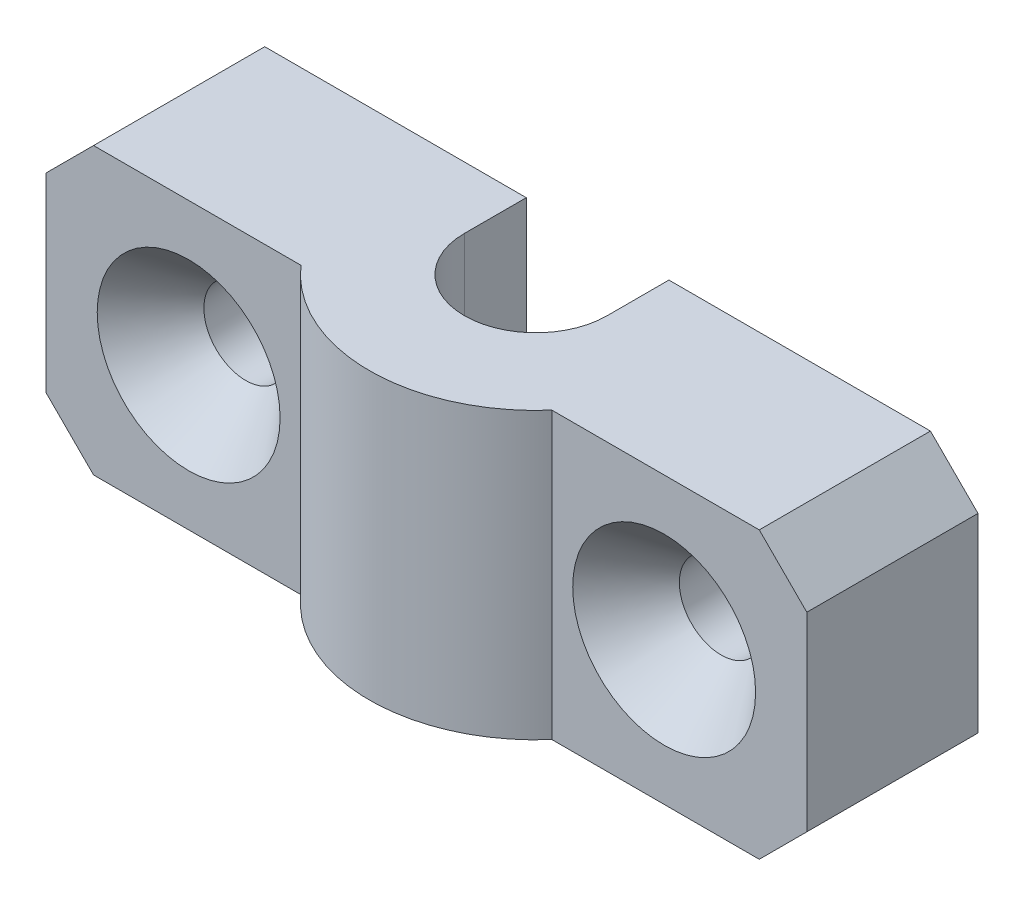
ISO-10303-21;
HEADER;
FILE_DESCRIPTION(('STEP AP214'),'2;1');
FILE_NAME('part.step','',(''),(''),'','','');
FILE_SCHEMA(('AUTOMOTIVE_DESIGN { 1 0 10303 214 1 1 1 1 }'));
ENDSEC;
DATA;
#1=APPLICATION_CONTEXT('core data for automotive mechanical design processes');
#2=APPLICATION_PROTOCOL_DEFINITION('international standard','automotive_design',2000,#1);
#3=PRODUCT_CONTEXT('',#1,'mechanical');
#4=PRODUCT('Part','Part','',(#3));
#5=PRODUCT_RELATED_PRODUCT_CATEGORY('part','',(#4));
#6=PRODUCT_DEFINITION_FORMATION('','',#4);
#7=PRODUCT_DEFINITION_CONTEXT('part definition',#1,'design');
#8=PRODUCT_DEFINITION('design','',#6,#7);
#9=PRODUCT_DEFINITION_SHAPE('','',#8);
#10=(LENGTH_UNIT() NAMED_UNIT(*) SI_UNIT(.MILLI.,.METRE.));
#11=(NAMED_UNIT(*) PLANE_ANGLE_UNIT() SI_UNIT($,.RADIAN.));
#12=(NAMED_UNIT(*) SI_UNIT($,.STERADIAN.) SOLID_ANGLE_UNIT());
#13=UNCERTAINTY_MEASURE_WITH_UNIT(LENGTH_MEASURE(1.E-05),#10,'distance_accuracy_value','');
#14=(GEOMETRIC_REPRESENTATION_CONTEXT(3) GLOBAL_UNCERTAINTY_ASSIGNED_CONTEXT((#13)) GLOBAL_UNIT_ASSIGNED_CONTEXT((#10,
#11,#12)) REPRESENTATION_CONTEXT('',''));
#15=CARTESIAN_POINT('',(0.,0.,0.));
#16=DIRECTION('',(0.,0.,1.));
#17=DIRECTION('',(1.,0.,0.));
#18=AXIS2_PLACEMENT_3D('',#15,#16,#17);
#19=CARTESIAN_POINT('',(0.,0.,9.));
#20=DIRECTION('',(0.,0.,1.));
#21=DIRECTION('',(1.,0.,0.));
#22=AXIS2_PLACEMENT_3D('',#19,#20,#21);
#23=PLANE('',#22);
#24=CARTESIAN_POINT('',(7.5,-7.5,9.));
#25=DIRECTION('',(0.,0.,1.));
#26=DIRECTION('',(1.,0.,0.));
#27=AXIS2_PLACEMENT_3D('',#24,#25,#26);
#28=CIRCLE('',#27,4.80786021344867);
#29=CARTESIAN_POINT('',(12.3078602134487,-7.5,9.));
#30=VERTEX_POINT('',#29);
#31=EDGE_CURVE('E340',#30,#30,#28,.T.);
#32=ORIENTED_EDGE('',*,*,#31,.F.);
#33=EDGE_LOOP('',(#32));
#34=FACE_BOUND('',#33,.T.);
#35=DIRECTION('',(-1.,0.,0.));
#36=VECTOR('',#35,1.);
#37=CARTESIAN_POINT('',(0.,0.,9.));
#38=LINE('',#37,#36);
#39=CARTESIAN_POINT('',(13.4045470208635,0.,9.));
#40=VERTEX_POINT('',#39);
#41=CARTESIAN_POINT('',(2.50000000000002,0.,9.));
#42=VERTEX_POINT('',#41);
#43=EDGE_CURVE('E211',#40,#42,#38,.T.);
#44=ORIENTED_EDGE('',*,*,#43,.T.);
#45=DIRECTION('',(0.707106781186549,0.707106781186546,0.));
#46=VECTOR('',#45,1.);
#47=CARTESIAN_POINT('',(1.25,-1.25000000000001,9.));
#48=LINE('',#47,#46);
#49=CARTESIAN_POINT('',(0.,-2.5,9.));
#50=VERTEX_POINT('',#49);
#51=EDGE_CURVE('E11',#42,#50,#48,.F.);
#52=ORIENTED_EDGE('',*,*,#51,.T.);
#53=DIRECTION('',(0.,-1.,0.));
#54=VECTOR('',#53,1.);
#55=CARTESIAN_POINT('',(0.,0.,9.));
#56=LINE('',#55,#54);
#57=CARTESIAN_POINT('',(0.,-12.5,9.));
#58=VERTEX_POINT('',#57);
#59=EDGE_CURVE('E155',#50,#58,#56,.T.);
#60=ORIENTED_EDGE('',*,*,#59,.T.);
#61=DIRECTION('',(-0.707106781186546,0.707106781186549,0.));
#62=VECTOR('',#61,1.);
#63=CARTESIAN_POINT('',(-6.24999999999999,-6.24999999999996,9.));
#64=LINE('',#63,#62);
#65=CARTESIAN_POINT('',(2.5,-15.,9.));
#66=VERTEX_POINT('',#65);
#67=EDGE_CURVE('E50',#58,#66,#64,.F.);
#68=ORIENTED_EDGE('',*,*,#67,.T.);
#69=DIRECTION('',(1.,0.,0.));
#70=VECTOR('',#69,1.);
#71=CARTESIAN_POINT('',(0.,-15.,9.));
#72=LINE('',#71,#70);
#73=CARTESIAN_POINT('',(13.4045470208635,-15.,9.));
#74=VERTEX_POINT('',#73);
#75=EDGE_CURVE('E154',#66,#74,#72,.T.);
#76=ORIENTED_EDGE('',*,*,#75,.T.);
#77=DIRECTION('',(0.,-1.,0.));
#78=VECTOR('',#77,1.);
#79=CARTESIAN_POINT('',(13.4045470208635,0.,9.));
#80=LINE('',#79,#78);
#81=EDGE_CURVE('E166',#40,#74,#80,.T.);
#82=ORIENTED_EDGE('',*,*,#81,.F.);
#83=EDGE_LOOP('',(#44,#52,#60,#68,#76,#82));
#84=FACE_BOUND('',#83,.T.);
#85=ADVANCED_FACE('F41',(#34,#84),#23,.T.);
#86=CARTESIAN_POINT('',(0.,0.,0.));
#87=DIRECTION('',(0.,0.,1.));
#88=DIRECTION('',(1.,0.,0.));
#89=AXIS2_PLACEMENT_3D('',#86,#87,#88);
#90=PLANE('',#89);
#91=CARTESIAN_POINT('',(32.5,-7.5,0.));
#92=DIRECTION('',(0.,0.,-1.));
#93=DIRECTION('',(-1.,0.,0.));
#94=AXIS2_PLACEMENT_3D('',#91,#92,#93);
#95=CIRCLE('',#94,2.2);
#96=CARTESIAN_POINT('',(30.3,-7.5,0.));
#97=VERTEX_POINT('',#96);
#98=EDGE_CURVE('E335',#97,#97,#95,.T.);
#99=ORIENTED_EDGE('',*,*,#98,.F.);
#100=EDGE_LOOP('',(#99));
#101=FACE_BOUND('',#100,.T.);
#102=DIRECTION('',(-1.,0.,0.));
#103=VECTOR('',#102,1.);
#104=CARTESIAN_POINT('',(0.,0.,0.));
#105=LINE('',#104,#103);
#106=CARTESIAN_POINT('',(37.5,0.,0.));
#107=VERTEX_POINT('',#106);
#108=CARTESIAN_POINT('',(23.75,0.,0.));
#109=VERTEX_POINT('',#108);
#110=EDGE_CURVE('E207',#107,#109,#105,.T.);
#111=ORIENTED_EDGE('',*,*,#110,.F.);
#112=DIRECTION('',(-0.707106781186547,0.707106781186549,0.));
#113=VECTOR('',#112,1.);
#114=CARTESIAN_POINT('',(37.5,0.,0.));
#115=LINE('',#114,#113);
#116=CARTESIAN_POINT('',(40.,-2.50000000000001,0.));
#117=VERTEX_POINT('',#116);
#118=EDGE_CURVE('E229',#107,#117,#115,.F.);
#119=ORIENTED_EDGE('',*,*,#118,.T.);
#120=DIRECTION('',(0.,1.,0.));
#121=VECTOR('',#120,1.);
#122=CARTESIAN_POINT('',(40.,0.,0.));
#123=LINE('',#122,#121);
#124=CARTESIAN_POINT('',(40.,-12.5,0.));
#125=VERTEX_POINT('',#124);
#126=EDGE_CURVE('E218',#125,#117,#123,.T.);
#127=ORIENTED_EDGE('',*,*,#126,.F.);
#128=DIRECTION('',(0.707106781186549,0.707106781186546,0.));
#129=VECTOR('',#128,1.);
#130=CARTESIAN_POINT('',(40.,-12.5,0.));
#131=LINE('',#130,#129);
#132=CARTESIAN_POINT('',(37.5,-15.,0.));
#133=VERTEX_POINT('',#132);
#134=EDGE_CURVE('E227',#125,#133,#131,.F.);
#135=ORIENTED_EDGE('',*,*,#134,.T.);
#136=DIRECTION('',(1.,0.,0.));
#137=VECTOR('',#136,1.);
#138=CARTESIAN_POINT('',(0.,-15.,0.));
#139=LINE('',#138,#137);
#140=CARTESIAN_POINT('',(23.75,-15.,0.));
#141=VERTEX_POINT('',#140);
#142=EDGE_CURVE('E215',#141,#133,#139,.T.);
#143=ORIENTED_EDGE('',*,*,#142,.F.);
#144=DIRECTION('',(0.,-1.,0.));
#145=VECTOR('',#144,1.);
#146=CARTESIAN_POINT('',(23.75,0.,0.));
#147=LINE('',#146,#145);
#148=EDGE_CURVE('E190',#109,#141,#147,.T.);
#149=ORIENTED_EDGE('',*,*,#148,.F.);
#150=EDGE_LOOP('',(#111,#119,#127,#135,#143,#149));
#151=FACE_BOUND('',#150,.T.);
#152=ADVANCED_FACE('F284',(#101,#151),#90,.F.);
#153=CARTESIAN_POINT('',(0.,0.,9.));
#154=DIRECTION('',(1.,0.,0.));
#155=DIRECTION('',(0.,0.,-1.));
#156=AXIS2_PLACEMENT_3D('',#153,#154,#155);
#157=PLANE('',#156);
#158=ORIENTED_EDGE('',*,*,#59,.F.);
#159=DIRECTION('',(0.,0.,-1.));
#160=VECTOR('',#159,1.);
#161=CARTESIAN_POINT('',(0.,-2.5,9.));
#162=LINE('',#161,#160);
#163=CARTESIAN_POINT('',(0.,-2.5,0.));
#164=VERTEX_POINT('',#163);
#165=EDGE_CURVE('E245',#50,#164,#162,.T.);
#166=ORIENTED_EDGE('',*,*,#165,.T.);
#167=DIRECTION('',(0.,-1.,0.));
#168=VECTOR('',#167,1.);
#169=CARTESIAN_POINT('',(0.,0.,0.));
#170=LINE('',#169,#168);
#171=CARTESIAN_POINT('',(0.,-12.5,0.));
#172=VERTEX_POINT('',#171);
#173=EDGE_CURVE('E201',#164,#172,#170,.T.);
#174=ORIENTED_EDGE('',*,*,#173,.T.);
#175=DIRECTION('',(0.,0.,1.));
#176=VECTOR('',#175,1.);
#177=CARTESIAN_POINT('',(0.,-12.5,9.));
#178=LINE('',#177,#176);
#179=EDGE_CURVE('E57',#172,#58,#178,.T.);
#180=ORIENTED_EDGE('',*,*,#179,.T.);
#181=EDGE_LOOP('',(#158,#166,#174,#180));
#182=FACE_BOUND('',#181,.T.);
#183=ADVANCED_FACE('F258',(#182),#157,.F.);
#184=CARTESIAN_POINT('',(0.,-15.,9.));
#185=DIRECTION('',(0.,1.,0.));
#186=DIRECTION('',(0.,0.,1.));
#187=AXIS2_PLACEMENT_3D('',#184,#185,#186);
#188=PLANE('',#187);
#189=ORIENTED_EDGE('',*,*,#142,.T.);
#190=DIRECTION('',(0.,0.,1.));
#191=VECTOR('',#190,1.);
#192=CARTESIAN_POINT('',(37.5,-15.,9.));
#193=LINE('',#192,#191);
#194=CARTESIAN_POINT('',(37.5,-15.,9.));
#195=VERTEX_POINT('',#194);
#196=EDGE_CURVE('E151',#133,#195,#193,.T.);
#197=ORIENTED_EDGE('',*,*,#196,.T.);
#198=CARTESIAN_POINT('',(26.5954529791365,-15.,9.));
#199=VERTEX_POINT('',#198);
#200=EDGE_CURVE('E143',#199,#195,#72,.T.);
#201=ORIENTED_EDGE('',*,*,#200,.F.);
#202=CARTESIAN_POINT('',(20.,-15.,3.25));
#203=DIRECTION('',(0.,-1.,0.));
#204=DIRECTION('',(0.,0.,-1.));
#205=AXIS2_PLACEMENT_3D('',#202,#203,#204);
#206=CIRCLE('',#205,8.75);
#207=EDGE_CURVE('E149',#199,#74,#206,.T.);
#208=ORIENTED_EDGE('',*,*,#207,.T.);
#209=ORIENTED_EDGE('',*,*,#75,.F.);
#210=DIRECTION('',(0.,0.,-1.));
#211=VECTOR('',#210,1.);
#212=CARTESIAN_POINT('',(2.5,-15.,9.));
#213=LINE('',#212,#211);
#214=CARTESIAN_POINT('',(2.5,-15.,0.));
#215=VERTEX_POINT('',#214);
#216=EDGE_CURVE('E240',#66,#215,#213,.T.);
#217=ORIENTED_EDGE('',*,*,#216,.T.);
#218=CARTESIAN_POINT('',(16.25,-15.,0.));
#219=VERTEX_POINT('',#218);
#220=EDGE_CURVE('E216',#215,#219,#139,.T.);
#221=ORIENTED_EDGE('',*,*,#220,.T.);
#222=DIRECTION('',(0.,0.,-1.));
#223=VECTOR('',#222,1.);
#224=CARTESIAN_POINT('',(16.25,-15.,0.));
#225=LINE('',#224,#223);
#226=CARTESIAN_POINT('',(16.25,-15.,3.25));
#227=VERTEX_POINT('',#226);
#228=EDGE_CURVE('E184',#227,#219,#225,.T.);
#229=ORIENTED_EDGE('',*,*,#228,.F.);
#230=CARTESIAN_POINT('',(20.,-15.,3.25));
#231=DIRECTION('',(0.,-1.,0.));
#232=DIRECTION('',(0.,0.,-1.));
#233=AXIS2_PLACEMENT_3D('',#230,#231,#232);
#234=CIRCLE('',#233,3.75000000000001);
#235=CARTESIAN_POINT('',(23.75,-15.,3.25));
#236=VERTEX_POINT('',#235);
#237=EDGE_CURVE('E193',#236,#227,#234,.T.);
#238=ORIENTED_EDGE('',*,*,#237,.F.);
#239=DIRECTION('',(0.,0.,-1.));
#240=VECTOR('',#239,1.);
#241=CARTESIAN_POINT('',(23.75,-15.,0.));
#242=LINE('',#241,#240);
#243=EDGE_CURVE('E178',#236,#141,#242,.T.);
#244=ORIENTED_EDGE('',*,*,#243,.T.);
#245=EDGE_LOOP('',(#189,#197,#201,#208,#209,#217,#221,#229,#238,#244));
#246=FACE_BOUND('',#245,.T.);
#247=ADVANCED_FACE('F146',(#246),#188,.F.);
#248=CARTESIAN_POINT('',(40.,0.,9.));
#249=DIRECTION('',(-1.,0.,0.));
#250=DIRECTION('',(0.,0.,1.));
#251=AXIS2_PLACEMENT_3D('',#248,#249,#250);
#252=PLANE('',#251);
#253=ORIENTED_EDGE('',*,*,#126,.T.);
#254=DIRECTION('',(0.,0.,1.));
#255=VECTOR('',#254,1.);
#256=CARTESIAN_POINT('',(40.,-2.50000000000001,9.));
#257=LINE('',#256,#255);
#258=CARTESIAN_POINT('',(40.,-2.50000000000001,9.));
#259=VERTEX_POINT('',#258);
#260=EDGE_CURVE('E234',#117,#259,#257,.T.);
#261=ORIENTED_EDGE('',*,*,#260,.T.);
#262=DIRECTION('',(0.,1.,0.));
#263=VECTOR('',#262,1.);
#264=CARTESIAN_POINT('',(40.,0.,9.));
#265=LINE('',#264,#263);
#266=CARTESIAN_POINT('',(40.,-12.5,9.));
#267=VERTEX_POINT('',#266);
#268=EDGE_CURVE('E209',#267,#259,#265,.T.);
#269=ORIENTED_EDGE('',*,*,#268,.F.);
#270=DIRECTION('',(0.,0.,-1.));
#271=VECTOR('',#270,1.);
#272=CARTESIAN_POINT('',(40.,-12.5,9.));
#273=LINE('',#272,#271);
#274=EDGE_CURVE('E231',#267,#125,#273,.T.);
#275=ORIENTED_EDGE('',*,*,#274,.T.);
#276=EDGE_LOOP('',(#253,#261,#269,#275));
#277=FACE_BOUND('',#276,.T.);
#278=ADVANCED_FACE('F292',(#277),#252,.F.);
#279=CARTESIAN_POINT('',(0.,0.,9.));
#280=DIRECTION('',(0.,-1.,0.));
#281=DIRECTION('',(0.,0.,-1.));
#282=AXIS2_PLACEMENT_3D('',#279,#280,#281);
#283=PLANE('',#282);
#284=CARTESIAN_POINT('',(37.5,0.,9.));
#285=VERTEX_POINT('',#284);
#286=CARTESIAN_POINT('',(26.5954529791365,0.,9.));
#287=VERTEX_POINT('',#286);
#288=EDGE_CURVE('E162',#285,#287,#38,.T.);
#289=ORIENTED_EDGE('',*,*,#288,.F.);
#290=DIRECTION('',(0.,0.,-1.));
#291=VECTOR('',#290,1.);
#292=CARTESIAN_POINT('',(37.5,0.,9.));
#293=LINE('',#292,#291);
#294=EDGE_CURVE('E224',#285,#107,#293,.T.);
#295=ORIENTED_EDGE('',*,*,#294,.T.);
#296=ORIENTED_EDGE('',*,*,#110,.T.);
#297=DIRECTION('',(0.,0.,-1.));
#298=VECTOR('',#297,1.);
#299=CARTESIAN_POINT('',(23.75,0.,0.));
#300=LINE('',#299,#298);
#301=CARTESIAN_POINT('',(23.75,0.,3.25));
#302=VERTEX_POINT('',#301);
#303=EDGE_CURVE('E180',#302,#109,#300,.T.);
#304=ORIENTED_EDGE('',*,*,#303,.F.);
#305=CARTESIAN_POINT('',(20.,0.,3.25));
#306=DIRECTION('',(0.,-1.,0.));
#307=DIRECTION('',(0.,0.,-1.));
#308=AXIS2_PLACEMENT_3D('',#305,#306,#307);
#309=CIRCLE('',#308,3.75000000000001);
#310=CARTESIAN_POINT('',(16.25,0.,3.25));
#311=VERTEX_POINT('',#310);
#312=EDGE_CURVE('E183',#302,#311,#309,.T.);
#313=ORIENTED_EDGE('',*,*,#312,.T.);
#314=DIRECTION('',(0.,0.,-1.));
#315=VECTOR('',#314,1.);
#316=CARTESIAN_POINT('',(16.25,0.,0.));
#317=LINE('',#316,#315);
#318=CARTESIAN_POINT('',(16.25,0.,0.));
#319=VERTEX_POINT('',#318);
#320=EDGE_CURVE('E187',#311,#319,#317,.T.);
#321=ORIENTED_EDGE('',*,*,#320,.T.);
#322=CARTESIAN_POINT('',(2.50000000000002,0.,0.));
#323=VERTEX_POINT('',#322);
#324=EDGE_CURVE('E221',#319,#323,#105,.T.);
#325=ORIENTED_EDGE('',*,*,#324,.T.);
#326=DIRECTION('',(0.,0.,1.));
#327=VECTOR('',#326,1.);
#328=CARTESIAN_POINT('',(2.50000000000002,0.,9.));
#329=LINE('',#328,#327);
#330=EDGE_CURVE('E213',#323,#42,#329,.T.);
#331=ORIENTED_EDGE('',*,*,#330,.T.);
#332=ORIENTED_EDGE('',*,*,#43,.F.);
#333=CARTESIAN_POINT('',(20.,0.,3.25));
#334=DIRECTION('',(0.,-1.,0.));
#335=DIRECTION('',(0.,0.,-1.));
#336=AXIS2_PLACEMENT_3D('',#333,#334,#335);
#337=CIRCLE('',#336,8.75);
#338=EDGE_CURVE('E167',#287,#40,#337,.T.);
#339=ORIENTED_EDGE('',*,*,#338,.F.);
#340=EDGE_LOOP('',(#289,#295,#296,#304,#313,#321,#325,#331,#332,#339));
#341=FACE_BOUND('',#340,.T.);
#342=ADVANCED_FACE('F266',(#341),#283,.F.);
#343=CARTESIAN_POINT('',(32.5,-7.5,9.));
#344=DIRECTION('',(0.,0.,-1.));
#345=DIRECTION('',(-1.,0.,0.));
#346=AXIS2_PLACEMENT_3D('',#343,#344,#345);
#347=CIRCLE('',#346,4.80786021344867);
#348=CARTESIAN_POINT('',(27.6921397865513,-7.5,9.));
#349=VERTEX_POINT('',#348);
#350=EDGE_CURVE('E330',#349,#349,#347,.T.);
#351=ORIENTED_EDGE('',*,*,#350,.T.);
#352=EDGE_LOOP('',(#351));
#353=FACE_BOUND('',#352,.T.);
#354=ORIENTED_EDGE('',*,*,#268,.T.);
#355=DIRECTION('',(0.707106781186547,-0.707106781186549,0.));
#356=VECTOR('',#355,1.);
#357=CARTESIAN_POINT('',(18.7500000000001,18.75,9.));
#358=LINE('',#357,#356);
#359=EDGE_CURVE('E238',#259,#285,#358,.F.);
#360=ORIENTED_EDGE('',*,*,#359,.T.);
#361=ORIENTED_EDGE('',*,*,#288,.T.);
#362=DIRECTION('',(0.,-1.,0.));
#363=VECTOR('',#362,1.);
#364=CARTESIAN_POINT('',(26.5954529791365,0.,9.));
#365=LINE('',#364,#363);
#366=EDGE_CURVE('E158',#287,#199,#365,.T.);
#367=ORIENTED_EDGE('',*,*,#366,.T.);
#368=ORIENTED_EDGE('',*,*,#200,.T.);
#369=DIRECTION('',(-0.707106781186549,-0.707106781186546,0.));
#370=VECTOR('',#369,1.);
#371=CARTESIAN_POINT('',(26.2499999999999,-26.25,9.));
#372=LINE('',#371,#370);
#373=EDGE_CURVE('E236',#195,#267,#372,.F.);
#374=ORIENTED_EDGE('',*,*,#373,.T.);
#375=EDGE_LOOP('',(#354,#360,#361,#367,#368,#374));
#376=FACE_BOUND('',#375,.T.);
#377=ADVANCED_FACE('F160',(#353,#376),#23,.T.);
#378=CARTESIAN_POINT('',(7.5,-7.5,0.));
#379=DIRECTION('',(0.,0.,1.));
#380=DIRECTION('',(1.,0.,0.));
#381=AXIS2_PLACEMENT_3D('',#378,#379,#380);
#382=CIRCLE('',#381,2.2);
#383=CARTESIAN_POINT('',(9.7,-7.5,0.));
#384=VERTEX_POINT('',#383);
#385=EDGE_CURVE('E171',#384,#384,#382,.T.);
#386=ORIENTED_EDGE('',*,*,#385,.T.);
#387=EDGE_LOOP('',(#386));
#388=FACE_BOUND('',#387,.T.);
#389=ORIENTED_EDGE('',*,*,#173,.F.);
#390=DIRECTION('',(-0.707106781186549,-0.707106781186546,0.));
#391=VECTOR('',#390,1.);
#392=CARTESIAN_POINT('',(0.,-2.5,0.));
#393=LINE('',#392,#391);
#394=EDGE_CURVE('E250',#164,#323,#393,.F.);
#395=ORIENTED_EDGE('',*,*,#394,.T.);
#396=ORIENTED_EDGE('',*,*,#324,.F.);
#397=DIRECTION('',(0.,-1.,0.));
#398=VECTOR('',#397,1.);
#399=CARTESIAN_POINT('',(16.25,0.,0.));
#400=LINE('',#399,#398);
#401=EDGE_CURVE('E198',#319,#219,#400,.T.);
#402=ORIENTED_EDGE('',*,*,#401,.T.);
#403=ORIENTED_EDGE('',*,*,#220,.F.);
#404=DIRECTION('',(0.707106781186546,-0.707106781186549,0.));
#405=VECTOR('',#404,1.);
#406=CARTESIAN_POINT('',(2.5,-15.,0.));
#407=LINE('',#406,#405);
#408=EDGE_CURVE('E248',#215,#172,#407,.F.);
#409=ORIENTED_EDGE('',*,*,#408,.T.);
#410=EDGE_LOOP('',(#389,#395,#396,#402,#403,#409));
#411=FACE_BOUND('',#410,.T.);
#412=ADVANCED_FACE('F257',(#388,#411),#90,.F.);
#413=CARTESIAN_POINT('',(16.25,0.,0.));
#414=DIRECTION('',(-1.,0.,0.));
#415=DIRECTION('',(0.,0.,1.));
#416=AXIS2_PLACEMENT_3D('',#413,#414,#415);
#417=PLANE('',#416);
#418=ORIENTED_EDGE('',*,*,#228,.T.);
#419=ORIENTED_EDGE('',*,*,#401,.F.);
#420=ORIENTED_EDGE('',*,*,#320,.F.);
#421=DIRECTION('',(0.,-1.,0.));
#422=VECTOR('',#421,1.);
#423=CARTESIAN_POINT('',(16.25,0.,3.25));
#424=LINE('',#423,#422);
#425=EDGE_CURVE('E202',#311,#227,#424,.T.);
#426=ORIENTED_EDGE('',*,*,#425,.T.);
#427=EDGE_LOOP('',(#418,#419,#420,#426));
#428=FACE_BOUND('',#427,.T.);
#429=ADVANCED_FACE('F272',(#428),#417,.F.);
#430=CARTESIAN_POINT('',(20.,0.,3.25));
#431=DIRECTION('',(0.,-1.,0.));
#432=DIRECTION('',(0.,0.,-1.));
#433=AXIS2_PLACEMENT_3D('',#430,#431,#432);
#434=CYLINDRICAL_SURFACE('',#433,3.75000000000001);
#435=ORIENTED_EDGE('',*,*,#237,.T.);
#436=ORIENTED_EDGE('',*,*,#425,.F.);
#437=ORIENTED_EDGE('',*,*,#312,.F.);
#438=DIRECTION('',(0.,-1.,0.));
#439=VECTOR('',#438,1.);
#440=CARTESIAN_POINT('',(23.75,0.,3.25));
#441=LINE('',#440,#439);
#442=EDGE_CURVE('E204',#302,#236,#441,.T.);
#443=ORIENTED_EDGE('',*,*,#442,.T.);
#444=EDGE_LOOP('',(#435,#436,#437,#443));
#445=FACE_BOUND('',#444,.T.);
#446=ADVANCED_FACE('F278',(#445),#434,.F.);
#447=CARTESIAN_POINT('',(23.75,0.,0.));
#448=DIRECTION('',(-1.,0.,0.));
#449=DIRECTION('',(0.,0.,1.));
#450=AXIS2_PLACEMENT_3D('',#447,#448,#449);
#451=PLANE('',#450);
#452=ORIENTED_EDGE('',*,*,#243,.F.);
#453=ORIENTED_EDGE('',*,*,#442,.F.);
#454=ORIENTED_EDGE('',*,*,#303,.T.);
#455=ORIENTED_EDGE('',*,*,#148,.T.);
#456=EDGE_LOOP('',(#452,#453,#454,#455));
#457=FACE_BOUND('',#456,.T.);
#458=ADVANCED_FACE('F280',(#457),#451,.T.);
#459=CARTESIAN_POINT('',(20.,0.,3.25));
#460=DIRECTION('',(0.,-1.,0.));
#461=DIRECTION('',(0.,0.,-1.));
#462=AXIS2_PLACEMENT_3D('',#459,#460,#461);
#463=CYLINDRICAL_SURFACE('',#462,8.75);
#464=ORIENTED_EDGE('',*,*,#207,.F.);
#465=ORIENTED_EDGE('',*,*,#366,.F.);
#466=ORIENTED_EDGE('',*,*,#338,.T.);
#467=ORIENTED_EDGE('',*,*,#81,.T.);
#468=EDGE_LOOP('',(#464,#465,#466,#467));
#469=FACE_BOUND('',#468,.T.);
#470=ADVANCED_FACE('F170',(#469),#463,.T.);
#471=CARTESIAN_POINT('',(7.5,-7.5,6.));
#472=DIRECTION('',(0.,0.,1.));
#473=DIRECTION('',(1.,0.,0.));
#474=AXIS2_PLACEMENT_3D('',#471,#472,#473);
#475=CYLINDRICAL_SURFACE('',#474,2.2);
#476=ORIENTED_EDGE('',*,*,#385,.F.);
#477=EDGE_LOOP('',(#476));
#478=FACE_BOUND('',#477,.T.);
#479=CARTESIAN_POINT('',(7.5,-7.5,6.));
#480=DIRECTION('',(0.,0.,1.));
#481=DIRECTION('',(1.,0.,0.));
#482=AXIS2_PLACEMENT_3D('',#479,#480,#481);
#483=CIRCLE('',#482,2.2);
#484=CARTESIAN_POINT('',(9.7,-7.5,6.));
#485=VERTEX_POINT('',#484);
#486=EDGE_CURVE('E175',#485,#485,#483,.T.);
#487=ORIENTED_EDGE('',*,*,#486,.T.);
#488=EDGE_LOOP('',(#487));
#489=FACE_BOUND('',#488,.T.);
#490=ADVANCED_FACE('F346',(#478,#489),#475,.F.);
#491=CARTESIAN_POINT('',(7.5,-7.5,9.));
#492=DIRECTION('',(0.,0.,1.));
#493=DIRECTION('',(1.,0.,0.));
#494=AXIS2_PLACEMENT_3D('',#491,#492,#493);
#495=CONICAL_SURFACE('',#494,4.80786021344867,0.715584993317673);
#496=ORIENTED_EDGE('',*,*,#486,.F.);
#497=EDGE_LOOP('',(#496));
#498=FACE_BOUND('',#497,.T.);
#499=ORIENTED_EDGE('',*,*,#31,.T.);
#500=EDGE_LOOP('',(#499));
#501=FACE_BOUND('',#500,.T.);
#502=ADVANCED_FACE('F348',(#498,#501),#495,.F.);
#503=CARTESIAN_POINT('',(32.5,-7.5,6.));
#504=DIRECTION('',(0.,0.,1.));
#505=DIRECTION('',(-1.,0.,0.));
#506=AXIS2_PLACEMENT_3D('',#503,#504,#505);
#507=CYLINDRICAL_SURFACE('',#506,2.2);
#508=ORIENTED_EDGE('',*,*,#98,.T.);
#509=EDGE_LOOP('',(#508));
#510=FACE_BOUND('',#509,.T.);
#511=CARTESIAN_POINT('',(32.5,-7.5,6.));
#512=DIRECTION('',(0.,0.,-1.));
#513=DIRECTION('',(-1.,0.,0.));
#514=AXIS2_PLACEMENT_3D('',#511,#512,#513);
#515=CIRCLE('',#514,2.2);
#516=CARTESIAN_POINT('',(30.3,-7.5,6.));
#517=VERTEX_POINT('',#516);
#518=EDGE_CURVE('E332',#517,#517,#515,.T.);
#519=ORIENTED_EDGE('',*,*,#518,.F.);
#520=EDGE_LOOP('',(#519));
#521=FACE_BOUND('',#520,.T.);
#522=ADVANCED_FACE('F305',(#510,#521),#507,.F.);
#523=CARTESIAN_POINT('',(32.5,-7.5,9.));
#524=DIRECTION('',(0.,0.,1.));
#525=DIRECTION('',(-1.,0.,0.));
#526=AXIS2_PLACEMENT_3D('',#523,#524,#525);
#527=CONICAL_SURFACE('',#526,4.80786021344867,0.715584993317673);
#528=ORIENTED_EDGE('',*,*,#518,.T.);
#529=EDGE_LOOP('',(#528));
#530=FACE_BOUND('',#529,.T.);
#531=ORIENTED_EDGE('',*,*,#350,.F.);
#532=EDGE_LOOP('',(#531));
#533=FACE_BOUND('',#532,.T.);
#534=ADVANCED_FACE('F298',(#530,#533),#527,.F.);
#535=CARTESIAN_POINT('',(37.5,0.,9.));
#536=DIRECTION('',(-0.707106781186549,-0.707106781186547,0.));
#537=DIRECTION('',(0.,0.,-1.));
#538=AXIS2_PLACEMENT_3D('',#535,#536,#537);
#539=PLANE('',#538);
#540=ORIENTED_EDGE('',*,*,#359,.F.);
#541=ORIENTED_EDGE('',*,*,#260,.F.);
#542=ORIENTED_EDGE('',*,*,#118,.F.);
#543=ORIENTED_EDGE('',*,*,#294,.F.);
#544=EDGE_LOOP('',(#540,#541,#542,#543));
#545=FACE_BOUND('',#544,.T.);
#546=ADVANCED_FACE('F295',(#545),#539,.F.);
#547=CARTESIAN_POINT('',(40.,-12.5,9.));
#548=DIRECTION('',(-0.707106781186545,0.707106781186549,0.));
#549=DIRECTION('',(0.,0.,-1.));
#550=AXIS2_PLACEMENT_3D('',#547,#548,#549);
#551=PLANE('',#550);
#552=ORIENTED_EDGE('',*,*,#373,.F.);
#553=ORIENTED_EDGE('',*,*,#196,.F.);
#554=ORIENTED_EDGE('',*,*,#134,.F.);
#555=ORIENTED_EDGE('',*,*,#274,.F.);
#556=EDGE_LOOP('',(#552,#553,#554,#555));
#557=FACE_BOUND('',#556,.T.);
#558=ADVANCED_FACE('F287',(#557),#551,.F.);
#559=CARTESIAN_POINT('',(0.,-2.5,9.));
#560=DIRECTION('',(0.707106781186545,-0.707106781186549,0.));
#561=DIRECTION('',(0.,0.,-1.));
#562=AXIS2_PLACEMENT_3D('',#559,#560,#561);
#563=PLANE('',#562);
#564=ORIENTED_EDGE('',*,*,#51,.F.);
#565=ORIENTED_EDGE('',*,*,#330,.F.);
#566=ORIENTED_EDGE('',*,*,#394,.F.);
#567=ORIENTED_EDGE('',*,*,#165,.F.);
#568=EDGE_LOOP('',(#564,#565,#566,#567));
#569=FACE_BOUND('',#568,.T.);
#570=ADVANCED_FACE('F261',(#569),#563,.F.);
#571=CARTESIAN_POINT('',(2.5,-15.,9.));
#572=DIRECTION('',(0.707106781186549,0.707106781186545,0.));
#573=DIRECTION('',(0.,0.,-1.));
#574=AXIS2_PLACEMENT_3D('',#571,#572,#573);
#575=PLANE('',#574);
#576=ORIENTED_EDGE('',*,*,#67,.F.);
#577=ORIENTED_EDGE('',*,*,#179,.F.);
#578=ORIENTED_EDGE('',*,*,#408,.F.);
#579=ORIENTED_EDGE('',*,*,#216,.F.);
#580=EDGE_LOOP('',(#576,#577,#578,#579));
#581=FACE_BOUND('',#580,.T.);
#582=ADVANCED_FACE('F44',(#581),#575,.F.);
#583=CLOSED_SHELL('',(#85,#152,#183,#247,#278,#342,#377,#412,#429,#446,#458,#470,#490,#502,#522,
#534,#546,#558,#570,#582));
#584=MANIFOLD_SOLID_BREP('B2',#583);
#585=ADVANCED_BREP_SHAPE_REPRESENTATION('',(#18,#584),#14);
#586=SHAPE_DEFINITION_REPRESENTATION(#9,#585);
ENDSEC;
END-ISO-10303-21;
